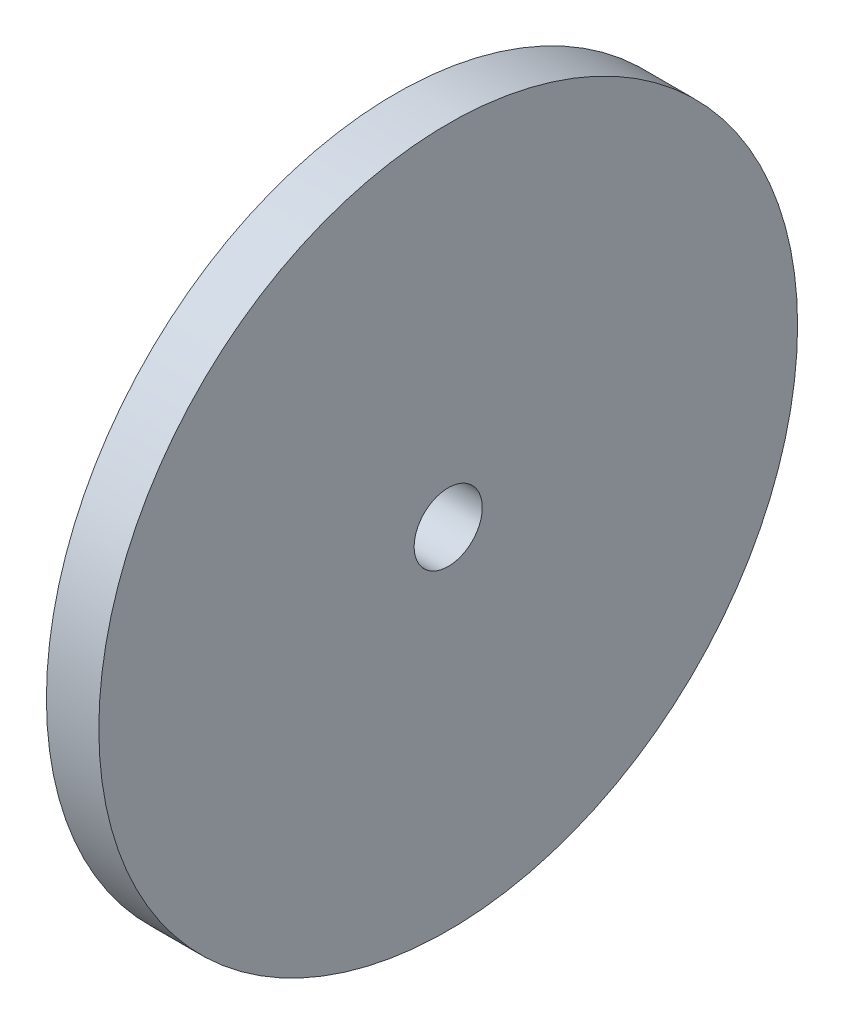
ISO-10303-21;
HEADER;
FILE_DESCRIPTION(('STEP AP214'),'2;1');
FILE_NAME('part.step','',(''),(''),'','','');
FILE_SCHEMA(('AUTOMOTIVE_DESIGN { 1 0 10303 214 1 1 1 1 }'));
ENDSEC;
DATA;
#1=APPLICATION_CONTEXT('core data for automotive mechanical design processes');
#2=APPLICATION_PROTOCOL_DEFINITION('international standard','automotive_design',2000,#1);
#3=PRODUCT_CONTEXT('',#1,'mechanical');
#4=PRODUCT('Part','Part','',(#3));
#5=PRODUCT_RELATED_PRODUCT_CATEGORY('part','',(#4));
#6=PRODUCT_DEFINITION_FORMATION('','',#4);
#7=PRODUCT_DEFINITION_CONTEXT('part definition',#1,'design');
#8=PRODUCT_DEFINITION('design','',#6,#7);
#9=PRODUCT_DEFINITION_SHAPE('','',#8);
#10=(LENGTH_UNIT() NAMED_UNIT(*) SI_UNIT(.MILLI.,.METRE.));
#11=(NAMED_UNIT(*) PLANE_ANGLE_UNIT() SI_UNIT($,.RADIAN.));
#12=(NAMED_UNIT(*) SI_UNIT($,.STERADIAN.) SOLID_ANGLE_UNIT());
#13=UNCERTAINTY_MEASURE_WITH_UNIT(LENGTH_MEASURE(1.E-05),#10,'distance_accuracy_value','');
#14=(GEOMETRIC_REPRESENTATION_CONTEXT(3) GLOBAL_UNCERTAINTY_ASSIGNED_CONTEXT((#13)) GLOBAL_UNIT_ASSIGNED_CONTEXT((#10,
#11,#12)) REPRESENTATION_CONTEXT('',''));
#15=CARTESIAN_POINT('',(0.,0.,0.));
#16=DIRECTION('',(0.,0.,1.));
#17=DIRECTION('',(1.,0.,0.));
#18=AXIS2_PLACEMENT_3D('',#15,#16,#17);
#19=CARTESIAN_POINT('',(-0.75,0.975,0.));
#20=DIRECTION('',(1.,0.,0.));
#21=DIRECTION('',(0.,0.,-1.));
#22=AXIS2_PLACEMENT_3D('',#19,#20,#21);
#23=PLANE('',#22);
#24=CARTESIAN_POINT('',(-0.75,0.,0.));
#25=DIRECTION('',(-1.,0.,0.));
#26=DIRECTION('',(0.,0.,1.));
#27=AXIS2_PLACEMENT_3D('',#24,#25,#26);
#28=CIRCLE('',#27,0.975);
#29=CARTESIAN_POINT('',(-0.75,0.,0.975));
#30=VERTEX_POINT('',#29);
#31=EDGE_CURVE('E54',#30,#30,#28,.T.);
#32=ORIENTED_EDGE('',*,*,#31,.F.);
#33=EDGE_LOOP('',(#32));
#34=FACE_BOUND('',#33,.T.);
#35=CARTESIAN_POINT('',(-0.75,0.,0.));
#36=DIRECTION('',(-1.,0.,0.));
#37=DIRECTION('',(0.,0.,1.));
#38=AXIS2_PLACEMENT_3D('',#35,#36,#37);
#39=CIRCLE('',#38,10.);
#40=CARTESIAN_POINT('',(-0.75,0.,10.));
#41=VERTEX_POINT('',#40);
#42=EDGE_CURVE('E10',#41,#41,#39,.T.);
#43=ORIENTED_EDGE('',*,*,#42,.T.);
#44=EDGE_LOOP('',(#43));
#45=FACE_BOUND('',#44,.T.);
#46=ADVANCED_FACE('F37',(#34,#45),#23,.F.);
#47=CARTESIAN_POINT('',(-0.75,0.,0.));
#48=DIRECTION('',(-1.,0.,0.));
#49=DIRECTION('',(0.,0.,1.));
#50=AXIS2_PLACEMENT_3D('',#47,#48,#49);
#51=CYLINDRICAL_SURFACE('',#50,10.);
#52=ORIENTED_EDGE('',*,*,#42,.F.);
#53=EDGE_LOOP('',(#52));
#54=FACE_BOUND('',#53,.T.);
#55=CARTESIAN_POINT('',(0.750000000000002,0.,0.));
#56=DIRECTION('',(-1.,0.,0.));
#57=DIRECTION('',(0.,0.,1.));
#58=AXIS2_PLACEMENT_3D('',#55,#56,#57);
#59=CIRCLE('',#58,10.);
#60=CARTESIAN_POINT('',(0.750000000000002,0.,10.));
#61=VERTEX_POINT('',#60);
#62=EDGE_CURVE('E44',#61,#61,#59,.T.);
#63=ORIENTED_EDGE('',*,*,#62,.T.);
#64=EDGE_LOOP('',(#63));
#65=FACE_BOUND('',#64,.T.);
#66=ADVANCED_FACE('F64',(#54,#65),#51,.T.);
#67=CARTESIAN_POINT('',(0.750000000000001,0.975,0.));
#68=DIRECTION('',(-1.,0.,0.));
#69=DIRECTION('',(0.,0.,1.));
#70=AXIS2_PLACEMENT_3D('',#67,#68,#69);
#71=PLANE('',#70);
#72=ORIENTED_EDGE('',*,*,#62,.F.);
#73=EDGE_LOOP('',(#72));
#74=FACE_BOUND('',#73,.T.);
#75=CARTESIAN_POINT('',(0.75,0.,0.));
#76=DIRECTION('',(-1.,0.,0.));
#77=DIRECTION('',(0.,0.,1.));
#78=AXIS2_PLACEMENT_3D('',#75,#76,#77);
#79=CIRCLE('',#78,0.975);
#80=CARTESIAN_POINT('',(0.75,0.,0.975));
#81=VERTEX_POINT('',#80);
#82=EDGE_CURVE('E49',#81,#81,#79,.T.);
#83=ORIENTED_EDGE('',*,*,#82,.T.);
#84=EDGE_LOOP('',(#83));
#85=FACE_BOUND('',#84,.T.);
#86=ADVANCED_FACE('F68',(#74,#85),#71,.F.);
#87=CARTESIAN_POINT('',(-0.75,0.,0.));
#88=DIRECTION('',(-1.,0.,0.));
#89=DIRECTION('',(0.,0.,1.));
#90=AXIS2_PLACEMENT_3D('',#87,#88,#89);
#91=CYLINDRICAL_SURFACE('',#90,0.975);
#92=ORIENTED_EDGE('',*,*,#82,.F.);
#93=EDGE_LOOP('',(#92));
#94=FACE_BOUND('',#93,.T.);
#95=ORIENTED_EDGE('',*,*,#31,.T.);
#96=EDGE_LOOP('',(#95));
#97=FACE_BOUND('',#96,.T.);
#98=ADVANCED_FACE('F61',(#94,#97),#91,.F.);
#99=CLOSED_SHELL('',(#46,#66,#86,#98));
#100=MANIFOLD_SOLID_BREP('B2',#99);
#101=ADVANCED_BREP_SHAPE_REPRESENTATION('',(#18,#100),#14);
#102=SHAPE_DEFINITION_REPRESENTATION(#9,#101);
ENDSEC;
END-ISO-10303-21;
